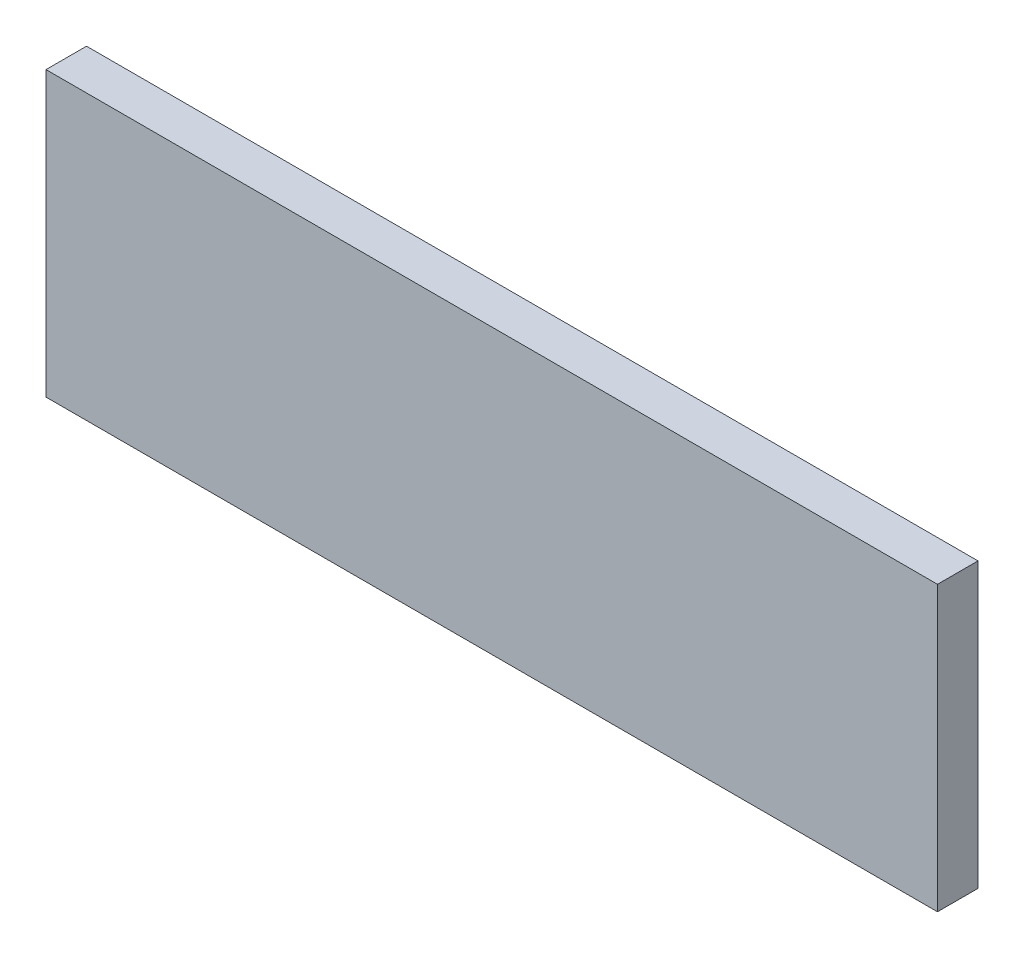
ISO-10303-21;
HEADER;
FILE_DESCRIPTION(('STEP AP214'),'2;1');
FILE_NAME('part.step','',(''),(''),'','','');
FILE_SCHEMA(('AUTOMOTIVE_DESIGN { 1 0 10303 214 1 1 1 1 }'));
ENDSEC;
DATA;
#1=APPLICATION_CONTEXT('core data for automotive mechanical design processes');
#2=APPLICATION_PROTOCOL_DEFINITION('international standard','automotive_design',2000,#1);
#3=PRODUCT_CONTEXT('',#1,'mechanical');
#4=PRODUCT('Part','Part','',(#3));
#5=PRODUCT_RELATED_PRODUCT_CATEGORY('part','',(#4));
#6=PRODUCT_DEFINITION_FORMATION('','',#4);
#7=PRODUCT_DEFINITION_CONTEXT('part definition',#1,'design');
#8=PRODUCT_DEFINITION('design','',#6,#7);
#9=PRODUCT_DEFINITION_SHAPE('','',#8);
#10=(LENGTH_UNIT() NAMED_UNIT(*) SI_UNIT(.MILLI.,.METRE.));
#11=(NAMED_UNIT(*) PLANE_ANGLE_UNIT() SI_UNIT($,.RADIAN.));
#12=(NAMED_UNIT(*) SI_UNIT($,.STERADIAN.) SOLID_ANGLE_UNIT());
#13=UNCERTAINTY_MEASURE_WITH_UNIT(LENGTH_MEASURE(1.E-05),#10,'distance_accuracy_value','');
#14=(GEOMETRIC_REPRESENTATION_CONTEXT(3) GLOBAL_UNCERTAINTY_ASSIGNED_CONTEXT((#13)) GLOBAL_UNIT_ASSIGNED_CONTEXT((#10,
#11,#12)) REPRESENTATION_CONTEXT('',''));
#15=CARTESIAN_POINT('',(0.,0.,0.));
#16=DIRECTION('',(0.,0.,1.));
#17=DIRECTION('',(1.,0.,0.));
#18=AXIS2_PLACEMENT_3D('',#15,#16,#17);
#19=CARTESIAN_POINT('',(165.,52.5,15.));
#20=DIRECTION('',(-1.,0.,0.));
#21=DIRECTION('',(0.,-1.,0.));
#22=AXIS2_PLACEMENT_3D('',#19,#20,#21);
#23=PLANE('',#22);
#24=DIRECTION('',(0.,1.,0.));
#25=VECTOR('',#24,1.);
#26=CARTESIAN_POINT('',(165.,52.5,0.));
#27=LINE('',#26,#25);
#28=CARTESIAN_POINT('',(165.,-52.5,0.));
#29=VERTEX_POINT('',#28);
#30=CARTESIAN_POINT('',(165.,52.5,0.));
#31=VERTEX_POINT('',#30);
#32=EDGE_CURVE('E107',#29,#31,#27,.T.);
#33=ORIENTED_EDGE('',*,*,#32,.T.);
#34=DIRECTION('',(0.,0.,-1.));
#35=VECTOR('',#34,1.);
#36=CARTESIAN_POINT('',(165.,52.5,15.));
#37=LINE('',#36,#35);
#38=CARTESIAN_POINT('',(165.,52.5,15.));
#39=VERTEX_POINT('',#38);
#40=EDGE_CURVE('E11',#39,#31,#37,.T.);
#41=ORIENTED_EDGE('',*,*,#40,.F.);
#42=DIRECTION('',(0.,1.,0.));
#43=VECTOR('',#42,1.);
#44=CARTESIAN_POINT('',(165.,52.5,15.));
#45=LINE('',#44,#43);
#46=CARTESIAN_POINT('',(165.,-52.5,15.));
#47=VERTEX_POINT('',#46);
#48=EDGE_CURVE('E91',#47,#39,#45,.T.);
#49=ORIENTED_EDGE('',*,*,#48,.F.);
#50=DIRECTION('',(0.,0.,-1.));
#51=VECTOR('',#50,1.);
#52=CARTESIAN_POINT('',(165.,-52.5,15.));
#53=LINE('',#52,#51);
#54=EDGE_CURVE('E103',#47,#29,#53,.T.);
#55=ORIENTED_EDGE('',*,*,#54,.T.);
#56=EDGE_LOOP('',(#33,#41,#49,#55));
#57=FACE_BOUND('',#56,.T.);
#58=ADVANCED_FACE('F39',(#57),#23,.F.);
#59=CARTESIAN_POINT('',(-165.,52.5,15.));
#60=DIRECTION('',(0.,-1.,0.));
#61=DIRECTION('',(0.,0.,-1.));
#62=AXIS2_PLACEMENT_3D('',#59,#60,#61);
#63=PLANE('',#62);
#64=DIRECTION('',(-1.,0.,0.));
#65=VECTOR('',#64,1.);
#66=CARTESIAN_POINT('',(-165.,52.5,0.));
#67=LINE('',#66,#65);
#68=CARTESIAN_POINT('',(-165.,52.5,0.));
#69=VERTEX_POINT('',#68);
#70=EDGE_CURVE('E96',#31,#69,#67,.T.);
#71=ORIENTED_EDGE('',*,*,#70,.T.);
#72=DIRECTION('',(0.,0.,-1.));
#73=VECTOR('',#72,1.);
#74=CARTESIAN_POINT('',(-165.,52.5,15.));
#75=LINE('',#74,#73);
#76=CARTESIAN_POINT('',(-165.,52.5,15.));
#77=VERTEX_POINT('',#76);
#78=EDGE_CURVE('E48',#77,#69,#75,.T.);
#79=ORIENTED_EDGE('',*,*,#78,.F.);
#80=DIRECTION('',(-1.,0.,0.));
#81=VECTOR('',#80,1.);
#82=CARTESIAN_POINT('',(-165.,52.5,15.));
#83=LINE('',#82,#81);
#84=EDGE_CURVE('E86',#39,#77,#83,.T.);
#85=ORIENTED_EDGE('',*,*,#84,.F.);
#86=ORIENTED_EDGE('',*,*,#40,.T.);
#87=EDGE_LOOP('',(#71,#79,#85,#86));
#88=FACE_BOUND('',#87,.T.);
#89=ADVANCED_FACE('F95',(#88),#63,.F.);
#90=CARTESIAN_POINT('',(-165.,52.5,15.));
#91=DIRECTION('',(1.,0.,0.));
#92=DIRECTION('',(0.,1.,0.));
#93=AXIS2_PLACEMENT_3D('',#90,#91,#92);
#94=PLANE('',#93);
#95=DIRECTION('',(0.,-1.,0.));
#96=VECTOR('',#95,1.);
#97=CARTESIAN_POINT('',(-165.,52.5,0.));
#98=LINE('',#97,#96);
#99=CARTESIAN_POINT('',(-165.,-52.5,0.));
#100=VERTEX_POINT('',#99);
#101=EDGE_CURVE('E73',#69,#100,#98,.T.);
#102=ORIENTED_EDGE('',*,*,#101,.T.);
#103=DIRECTION('',(0.,0.,-1.));
#104=VECTOR('',#103,1.);
#105=CARTESIAN_POINT('',(-165.,-52.5,15.));
#106=LINE('',#105,#104);
#107=CARTESIAN_POINT('',(-165.,-52.5,15.));
#108=VERTEX_POINT('',#107);
#109=EDGE_CURVE('E98',#108,#100,#106,.T.);
#110=ORIENTED_EDGE('',*,*,#109,.F.);
#111=DIRECTION('',(0.,-1.,0.));
#112=VECTOR('',#111,1.);
#113=CARTESIAN_POINT('',(-165.,52.5,15.));
#114=LINE('',#113,#112);
#115=EDGE_CURVE('E89',#77,#108,#114,.T.);
#116=ORIENTED_EDGE('',*,*,#115,.F.);
#117=ORIENTED_EDGE('',*,*,#78,.T.);
#118=EDGE_LOOP('',(#102,#110,#116,#117));
#119=FACE_BOUND('',#118,.T.);
#120=ADVANCED_FACE('F99',(#119),#94,.F.);
#121=CARTESIAN_POINT('',(-165.,-52.5,15.));
#122=DIRECTION('',(0.,1.,0.));
#123=DIRECTION('',(0.,0.,1.));
#124=AXIS2_PLACEMENT_3D('',#121,#122,#123);
#125=PLANE('',#124);
#126=DIRECTION('',(1.,0.,0.));
#127=VECTOR('',#126,1.);
#128=CARTESIAN_POINT('',(-165.,-52.5,0.));
#129=LINE('',#128,#127);
#130=EDGE_CURVE('E79',#100,#29,#129,.T.);
#131=ORIENTED_EDGE('',*,*,#130,.T.);
#132=ORIENTED_EDGE('',*,*,#54,.F.);
#133=DIRECTION('',(1.,0.,0.));
#134=VECTOR('',#133,1.);
#135=CARTESIAN_POINT('',(-165.,-52.5,15.));
#136=LINE('',#135,#134);
#137=EDGE_CURVE('E56',#108,#47,#136,.T.);
#138=ORIENTED_EDGE('',*,*,#137,.F.);
#139=ORIENTED_EDGE('',*,*,#109,.T.);
#140=EDGE_LOOP('',(#131,#132,#138,#139));
#141=FACE_BOUND('',#140,.T.);
#142=ADVANCED_FACE('F120',(#141),#125,.F.);
#143=CARTESIAN_POINT('',(0.,0.,15.));
#144=DIRECTION('',(0.,0.,1.));
#145=DIRECTION('',(1.,0.,0.));
#146=AXIS2_PLACEMENT_3D('',#143,#144,#145);
#147=PLANE('',#146);
#148=ORIENTED_EDGE('',*,*,#48,.T.);
#149=ORIENTED_EDGE('',*,*,#84,.T.);
#150=ORIENTED_EDGE('',*,*,#115,.T.);
#151=ORIENTED_EDGE('',*,*,#137,.T.);
#152=EDGE_LOOP('',(#148,#149,#150,#151));
#153=FACE_BOUND('',#152,.T.);
#154=ADVANCED_FACE('F87',(#153),#147,.T.);
#155=CARTESIAN_POINT('',(0.,0.,0.));
#156=DIRECTION('',(0.,0.,1.));
#157=DIRECTION('',(1.,0.,0.));
#158=AXIS2_PLACEMENT_3D('',#155,#156,#157);
#159=PLANE('',#158);
#160=ORIENTED_EDGE('',*,*,#32,.F.);
#161=ORIENTED_EDGE('',*,*,#130,.F.);
#162=ORIENTED_EDGE('',*,*,#101,.F.);
#163=ORIENTED_EDGE('',*,*,#70,.F.);
#164=EDGE_LOOP('',(#160,#161,#162,#163));
#165=FACE_BOUND('',#164,.T.);
#166=ADVANCED_FACE('F123',(#165),#159,.F.);
#167=CLOSED_SHELL('',(#58,#89,#120,#142,#154,#166));
#168=MANIFOLD_SOLID_BREP('B2',#167);
#169=ADVANCED_BREP_SHAPE_REPRESENTATION('',(#18,#168),#14);
#170=SHAPE_DEFINITION_REPRESENTATION(#9,#169);
ENDSEC;
END-ISO-10303-21;
